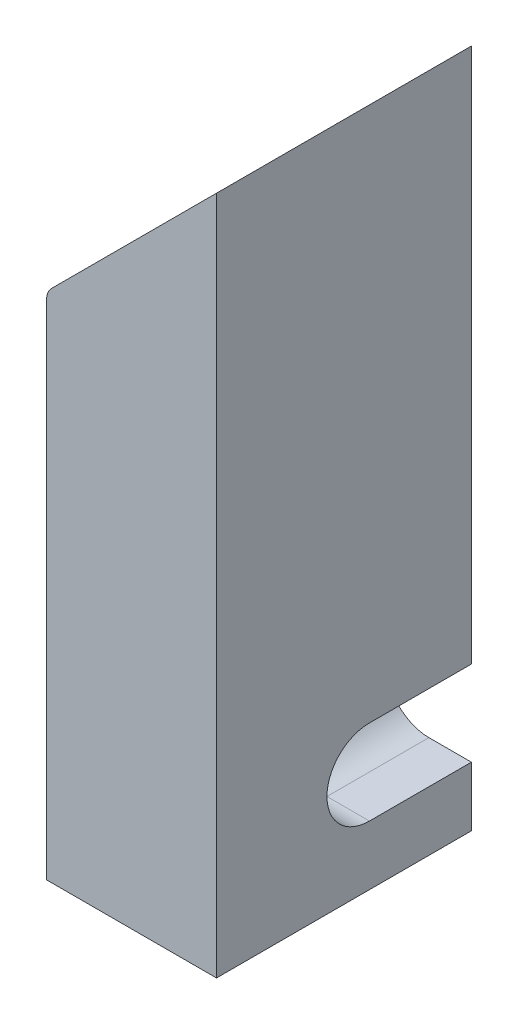
ISO-10303-21;
HEADER;
FILE_DESCRIPTION(('STEP AP214'),'2;1');
FILE_NAME('part.step','',(''),(''),'','','');
FILE_SCHEMA(('AUTOMOTIVE_DESIGN { 1 0 10303 214 1 1 1 1 }'));
ENDSEC;
DATA;
#1=APPLICATION_CONTEXT('core data for automotive mechanical design processes');
#2=APPLICATION_PROTOCOL_DEFINITION('international standard','automotive_design',2000,#1);
#3=PRODUCT_CONTEXT('',#1,'mechanical');
#4=PRODUCT('Part','Part','',(#3));
#5=PRODUCT_RELATED_PRODUCT_CATEGORY('part','',(#4));
#6=PRODUCT_DEFINITION_FORMATION('','',#4);
#7=PRODUCT_DEFINITION_CONTEXT('part definition',#1,'design');
#8=PRODUCT_DEFINITION('design','',#6,#7);
#9=PRODUCT_DEFINITION_SHAPE('','',#8);
#10=(LENGTH_UNIT() NAMED_UNIT(*) SI_UNIT(.MILLI.,.METRE.));
#11=(NAMED_UNIT(*) PLANE_ANGLE_UNIT() SI_UNIT($,.RADIAN.));
#12=(NAMED_UNIT(*) SI_UNIT($,.STERADIAN.) SOLID_ANGLE_UNIT());
#13=UNCERTAINTY_MEASURE_WITH_UNIT(LENGTH_MEASURE(1.E-05),#10,'distance_accuracy_value','');
#14=(GEOMETRIC_REPRESENTATION_CONTEXT(3) GLOBAL_UNCERTAINTY_ASSIGNED_CONTEXT((#13)) GLOBAL_UNIT_ASSIGNED_CONTEXT((#10,
#11,#12)) REPRESENTATION_CONTEXT('',''));
#15=CARTESIAN_POINT('',(0.,0.,0.));
#16=DIRECTION('',(0.,0.,1.));
#17=DIRECTION('',(1.,0.,0.));
#18=AXIS2_PLACEMENT_3D('',#15,#16,#17);
#19=CARTESIAN_POINT('',(10.,6.,6.));
#20=DIRECTION('',(-1.,0.,0.));
#21=DIRECTION('',(0.,0.,1.));
#22=AXIS2_PLACEMENT_3D('',#19,#20,#21);
#23=CYLINDRICAL_SURFACE('',#22,2.5);
#24=CARTESIAN_POINT('',(0.,6.,6.));
#25=DIRECTION('',(-1.,0.,0.));
#26=DIRECTION('',(0.,0.,1.));
#27=AXIS2_PLACEMENT_3D('',#24,#25,#26);
#28=CIRCLE('',#27,2.5);
#29=CARTESIAN_POINT('',(0.,6.,8.5));
#30=VERTEX_POINT('',#29);
#31=EDGE_CURVE('E144',#30,#30,#28,.T.);
#32=ORIENTED_EDGE('',*,*,#31,.T.);
#33=EDGE_LOOP('',(#32));
#34=FACE_BOUND('',#33,.T.);
#35=DIRECTION('',(-1.,0.,0.));
#36=VECTOR('',#35,1.);
#37=CARTESIAN_POINT('',(0.,3.5,5.99999999999999));
#38=LINE('',#37,#36);
#39=CARTESIAN_POINT('',(10.,3.5,5.99999999999999));
#40=VERTEX_POINT('',#39);
#41=CARTESIAN_POINT('',(7.5,3.5,5.99999999999999));
#42=VERTEX_POINT('',#41);
#43=EDGE_CURVE('E119',#40,#42,#38,.T.);
#44=ORIENTED_EDGE('',*,*,#43,.T.);
#45=CARTESIAN_POINT('',(7.5,6.,6.));
#46=DIRECTION('',(-0.707106781186547,0.,0.707106781186547));
#47=DIRECTION('',(-0.707106781186547,0.,-0.707106781186547));
#48=AXIS2_PLACEMENT_3D('',#45,#46,#47);
#49=ELLIPSE('',#48,3.53553390593274,2.5);
#50=CARTESIAN_POINT('',(7.5,8.5,5.99999999999999));
#51=VERTEX_POINT('',#50);
#52=EDGE_CURVE('E176',#42,#51,#49,.F.);
#53=ORIENTED_EDGE('',*,*,#52,.T.);
#54=DIRECTION('',(1.,0.,0.));
#55=VECTOR('',#54,1.);
#56=CARTESIAN_POINT('',(0.,8.50000000000001,5.99999999999999));
#57=LINE('',#56,#55);
#58=CARTESIAN_POINT('',(10.,8.5,6.));
#59=VERTEX_POINT('',#58);
#60=EDGE_CURVE('E129',#51,#59,#57,.T.);
#61=ORIENTED_EDGE('',*,*,#60,.T.);
#62=CARTESIAN_POINT('',(10.,6.,6.));
#63=DIRECTION('',(-1.,0.,0.));
#64=DIRECTION('',(0.,0.,1.));
#65=AXIS2_PLACEMENT_3D('',#62,#63,#64);
#66=CIRCLE('',#65,2.5);
#67=EDGE_CURVE('E137',#40,#59,#66,.T.);
#68=ORIENTED_EDGE('',*,*,#67,.F.);
#69=EDGE_LOOP('',(#44,#53,#61,#68));
#70=FACE_BOUND('',#69,.T.);
#71=ADVANCED_FACE('F48',(#34,#70),#23,.F.);
#72=CARTESIAN_POINT('',(0.,0.,15.));
#73=DIRECTION('',(0.,1.,0.));
#74=DIRECTION('',(0.,0.,1.));
#75=AXIS2_PLACEMENT_3D('',#72,#73,#74);
#76=PLANE('',#75);
#77=DIRECTION('',(1.,0.,0.));
#78=VECTOR('',#77,1.);
#79=CARTESIAN_POINT('',(0.,0.,0.));
#80=LINE('',#79,#78);
#81=CARTESIAN_POINT('',(0.,0.,0.));
#82=VERTEX_POINT('',#81);
#83=CARTESIAN_POINT('',(10.,0.,0.));
#84=VERTEX_POINT('',#83);
#85=EDGE_CURVE('E143',#82,#84,#80,.T.);
#86=ORIENTED_EDGE('',*,*,#85,.T.);
#87=DIRECTION('',(0.,0.,-1.));
#88=VECTOR('',#87,1.);
#89=CARTESIAN_POINT('',(10.,0.,15.));
#90=LINE('',#89,#88);
#91=CARTESIAN_POINT('',(10.,0.,15.));
#92=VERTEX_POINT('',#91);
#93=EDGE_CURVE('E174',#92,#84,#90,.T.);
#94=ORIENTED_EDGE('',*,*,#93,.F.);
#95=DIRECTION('',(1.,0.,0.));
#96=VECTOR('',#95,1.);
#97=CARTESIAN_POINT('',(0.,0.,15.));
#98=LINE('',#97,#96);
#99=CARTESIAN_POINT('',(0.,0.,15.));
#100=VERTEX_POINT('',#99);
#101=EDGE_CURVE('E154',#100,#92,#98,.T.);
#102=ORIENTED_EDGE('',*,*,#101,.F.);
#103=DIRECTION('',(0.,0.,-1.));
#104=VECTOR('',#103,1.);
#105=CARTESIAN_POINT('',(0.,0.,15.));
#106=LINE('',#105,#104);
#107=EDGE_CURVE('E163',#100,#82,#106,.T.);
#108=ORIENTED_EDGE('',*,*,#107,.T.);
#109=EDGE_LOOP('',(#86,#94,#102,#108));
#110=FACE_BOUND('',#109,.T.);
#111=ADVANCED_FACE('F192',(#110),#76,.F.);
#112=CARTESIAN_POINT('',(10.,0.,15.));
#113=DIRECTION('',(-1.,0.,0.));
#114=DIRECTION('',(0.,0.,1.));
#115=AXIS2_PLACEMENT_3D('',#112,#113,#114);
#116=PLANE('',#115);
#117=DIRECTION('',(0.,1.,0.));
#118=VECTOR('',#117,1.);
#119=CARTESIAN_POINT('',(10.,0.,0.));
#120=LINE('',#119,#118);
#121=CARTESIAN_POINT('',(10.,3.5,0.));
#122=VERTEX_POINT('',#121);
#123=EDGE_CURVE('E139',#84,#122,#120,.T.);
#124=ORIENTED_EDGE('',*,*,#123,.T.);
#125=DIRECTION('',(0.,0.,-1.));
#126=VECTOR('',#125,1.);
#127=CARTESIAN_POINT('',(10.,3.5,5.99999999999999));
#128=LINE('',#127,#126);
#129=EDGE_CURVE('E123',#40,#122,#128,.T.);
#130=ORIENTED_EDGE('',*,*,#129,.F.);
#131=ORIENTED_EDGE('',*,*,#67,.T.);
#132=DIRECTION('',(0.,0.,-1.));
#133=VECTOR('',#132,1.);
#134=CARTESIAN_POINT('',(10.,8.5,5.99999999999999));
#135=LINE('',#134,#133);
#136=CARTESIAN_POINT('',(10.,8.5,0.));
#137=VERTEX_POINT('',#136);
#138=EDGE_CURVE('E150',#59,#137,#135,.T.);
#139=ORIENTED_EDGE('',*,*,#138,.T.);
#140=CARTESIAN_POINT('',(10.,40.,0.));
#141=VERTEX_POINT('',#140);
#142=EDGE_CURVE('E147',#137,#141,#120,.T.);
#143=ORIENTED_EDGE('',*,*,#142,.T.);
#144=DIRECTION('',(0.,0.,-1.));
#145=VECTOR('',#144,1.);
#146=CARTESIAN_POINT('',(10.,40.,15.));
#147=LINE('',#146,#145);
#148=CARTESIAN_POINT('',(10.,40.,15.));
#149=VERTEX_POINT('',#148);
#150=EDGE_CURVE('E171',#149,#141,#147,.T.);
#151=ORIENTED_EDGE('',*,*,#150,.F.);
#152=DIRECTION('',(0.,1.,0.));
#153=VECTOR('',#152,1.);
#154=CARTESIAN_POINT('',(10.,0.,15.));
#155=LINE('',#154,#153);
#156=EDGE_CURVE('E157',#92,#149,#155,.T.);
#157=ORIENTED_EDGE('',*,*,#156,.F.);
#158=ORIENTED_EDGE('',*,*,#93,.T.);
#159=EDGE_LOOP('',(#124,#130,#131,#139,#143,#151,#157,#158));
#160=FACE_BOUND('',#159,.T.);
#161=ADVANCED_FACE('F135',(#160),#116,.F.);
#162=CARTESIAN_POINT('',(0.,30.,15.));
#163=DIRECTION('',(0.707106781186548,-0.707106781186547,0.));
#164=DIRECTION('',(0.707106781186547,0.707106781186548,0.));
#165=AXIS2_PLACEMENT_3D('',#162,#163,#164);
#166=PLANE('',#165);
#167=DIRECTION('',(-0.707106781186547,-0.707106781186548,0.));
#168=VECTOR('',#167,1.);
#169=CARTESIAN_POINT('',(0.,30.,0.));
#170=LINE('',#169,#168);
#171=CARTESIAN_POINT('',(0.292893218813452,30.2928932188135,0.));
#172=VERTEX_POINT('',#171);
#173=EDGE_CURVE('E166',#141,#172,#170,.T.);
#174=ORIENTED_EDGE('',*,*,#173,.T.);
#175=DIRECTION('',(0.,0.,-1.));
#176=VECTOR('',#175,1.);
#177=CARTESIAN_POINT('',(0.292893218813452,30.2928932188135,15.));
#178=LINE('',#177,#176);
#179=CARTESIAN_POINT('',(0.292893218813452,30.2928932188135,15.));
#180=VERTEX_POINT('',#179);
#181=EDGE_CURVE('E56',#172,#180,#178,.F.);
#182=ORIENTED_EDGE('',*,*,#181,.T.);
#183=DIRECTION('',(-0.707106781186547,-0.707106781186548,0.));
#184=VECTOR('',#183,1.);
#185=CARTESIAN_POINT('',(0.,30.,15.));
#186=LINE('',#185,#184);
#187=EDGE_CURVE('E160',#149,#180,#186,.T.);
#188=ORIENTED_EDGE('',*,*,#187,.F.);
#189=ORIENTED_EDGE('',*,*,#150,.T.);
#190=EDGE_LOOP('',(#174,#182,#188,#189));
#191=FACE_BOUND('',#190,.T.);
#192=ADVANCED_FACE('F220',(#191),#166,.F.);
#193=CARTESIAN_POINT('',(0.,0.,15.));
#194=DIRECTION('',(1.,0.,0.));
#195=DIRECTION('',(0.,0.,-1.));
#196=AXIS2_PLACEMENT_3D('',#193,#194,#195);
#197=PLANE('',#196);
#198=ORIENTED_EDGE('',*,*,#31,.F.);
#199=EDGE_LOOP('',(#198));
#200=FACE_BOUND('',#199,.T.);
#201=DIRECTION('',(0.,-1.,0.));
#202=VECTOR('',#201,1.);
#203=CARTESIAN_POINT('',(0.,0.,15.));
#204=LINE('',#203,#202);
#205=CARTESIAN_POINT('',(0.,29.5857864376269,15.));
#206=VERTEX_POINT('',#205);
#207=EDGE_CURVE('E162',#206,#100,#204,.T.);
#208=ORIENTED_EDGE('',*,*,#207,.F.);
#209=DIRECTION('',(0.,0.,-1.));
#210=VECTOR('',#209,1.);
#211=CARTESIAN_POINT('',(0.,29.5857864376269,15.));
#212=LINE('',#211,#210);
#213=CARTESIAN_POINT('',(0.,29.5857864376269,0.));
#214=VERTEX_POINT('',#213);
#215=EDGE_CURVE('E178',#206,#214,#212,.T.);
#216=ORIENTED_EDGE('',*,*,#215,.T.);
#217=DIRECTION('',(0.,-1.,0.));
#218=VECTOR('',#217,1.);
#219=CARTESIAN_POINT('',(0.,0.,0.));
#220=LINE('',#219,#218);
#221=EDGE_CURVE('E158',#214,#82,#220,.T.);
#222=ORIENTED_EDGE('',*,*,#221,.T.);
#223=ORIENTED_EDGE('',*,*,#107,.F.);
#224=EDGE_LOOP('',(#208,#216,#222,#223));
#225=FACE_BOUND('',#224,.T.);
#226=ADVANCED_FACE('F184',(#200,#225),#197,.F.);
#227=CARTESIAN_POINT('',(0.,0.,15.));
#228=DIRECTION('',(0.,0.,1.));
#229=DIRECTION('',(1.,0.,0.));
#230=AXIS2_PLACEMENT_3D('',#227,#228,#229);
#231=PLANE('',#230);
#232=ORIENTED_EDGE('',*,*,#187,.T.);
#233=CARTESIAN_POINT('',(1.,29.5857864376269,15.));
#234=DIRECTION('',(0.,0.,1.));
#235=DIRECTION('',(1.,0.,0.));
#236=AXIS2_PLACEMENT_3D('',#233,#234,#235);
#237=CIRCLE('',#236,1.);
#238=EDGE_CURVE('E12',#180,#206,#237,.T.);
#239=ORIENTED_EDGE('',*,*,#238,.T.);
#240=ORIENTED_EDGE('',*,*,#207,.T.);
#241=ORIENTED_EDGE('',*,*,#101,.T.);
#242=ORIENTED_EDGE('',*,*,#156,.T.);
#243=EDGE_LOOP('',(#232,#239,#240,#241,#242));
#244=FACE_BOUND('',#243,.T.);
#245=ADVANCED_FACE('F195',(#244),#231,.T.);
#246=CARTESIAN_POINT('',(0.,0.,0.));
#247=DIRECTION('',(0.,0.,1.));
#248=DIRECTION('',(1.,0.,0.));
#249=AXIS2_PLACEMENT_3D('',#246,#247,#248);
#250=PLANE('',#249);
#251=ORIENTED_EDGE('',*,*,#221,.F.);
#252=CARTESIAN_POINT('',(1.,29.5857864376269,0.));
#253=DIRECTION('',(0.,0.,1.));
#254=DIRECTION('',(1.,0.,0.));
#255=AXIS2_PLACEMENT_3D('',#252,#253,#254);
#256=CIRCLE('',#255,1.);
#257=EDGE_CURVE('E70',#214,#172,#256,.F.);
#258=ORIENTED_EDGE('',*,*,#257,.T.);
#259=ORIENTED_EDGE('',*,*,#173,.F.);
#260=ORIENTED_EDGE('',*,*,#142,.F.);
#261=DIRECTION('',(1.,0.,0.));
#262=VECTOR('',#261,1.);
#263=CARTESIAN_POINT('',(0.,8.50000000000001,0.));
#264=LINE('',#263,#262);
#265=CARTESIAN_POINT('',(7.5,8.5,0.));
#266=VERTEX_POINT('',#265);
#267=EDGE_CURVE('E130',#266,#137,#264,.T.);
#268=ORIENTED_EDGE('',*,*,#267,.F.);
#269=CARTESIAN_POINT('',(7.5,6.,0.));
#270=DIRECTION('',(0.,0.,-1.));
#271=DIRECTION('',(-1.,0.,0.));
#272=AXIS2_PLACEMENT_3D('',#269,#270,#271);
#273=CIRCLE('',#272,2.5);
#274=CARTESIAN_POINT('',(7.5,3.5,0.));
#275=VERTEX_POINT('',#274);
#276=EDGE_CURVE('E295',#275,#266,#273,.T.);
#277=ORIENTED_EDGE('',*,*,#276,.F.);
#278=DIRECTION('',(-1.,0.,0.));
#279=VECTOR('',#278,1.);
#280=CARTESIAN_POINT('',(0.,3.5,0.));
#281=LINE('',#280,#279);
#282=EDGE_CURVE('E298',#122,#275,#281,.T.);
#283=ORIENTED_EDGE('',*,*,#282,.F.);
#284=ORIENTED_EDGE('',*,*,#123,.F.);
#285=ORIENTED_EDGE('',*,*,#85,.F.);
#286=EDGE_LOOP('',(#251,#258,#259,#260,#268,#277,#283,#284,#285));
#287=FACE_BOUND('',#286,.T.);
#288=ADVANCED_FACE('F189',(#287),#250,.F.);
#289=CARTESIAN_POINT('',(7.5,6.,5.99999999999999));
#290=DIRECTION('',(0.,0.,-1.));
#291=DIRECTION('',(-1.,0.,0.));
#292=AXIS2_PLACEMENT_3D('',#289,#290,#291);
#293=CYLINDRICAL_SURFACE('',#292,2.5);
#294=DIRECTION('',(0.,0.,-1.));
#295=VECTOR('',#294,1.);
#296=CARTESIAN_POINT('',(7.5,3.5,5.99999999999999));
#297=LINE('',#296,#295);
#298=EDGE_CURVE('E125',#42,#275,#297,.T.);
#299=ORIENTED_EDGE('',*,*,#298,.T.);
#300=ORIENTED_EDGE('',*,*,#276,.T.);
#301=DIRECTION('',(0.,0.,-1.));
#302=VECTOR('',#301,1.);
#303=CARTESIAN_POINT('',(7.5,8.5,5.99999999999999));
#304=LINE('',#303,#302);
#305=EDGE_CURVE('E297',#51,#266,#304,.T.);
#306=ORIENTED_EDGE('',*,*,#305,.F.);
#307=ORIENTED_EDGE('',*,*,#52,.F.);
#308=EDGE_LOOP('',(#299,#300,#306,#307));
#309=FACE_BOUND('',#308,.T.);
#310=ADVANCED_FACE('F217',(#309),#293,.F.);
#311=CARTESIAN_POINT('',(0.,3.5,5.99999999999999));
#312=DIRECTION('',(0.,-1.,0.));
#313=DIRECTION('',(1.,0.,0.));
#314=AXIS2_PLACEMENT_3D('',#311,#312,#313);
#315=PLANE('',#314);
#316=ORIENTED_EDGE('',*,*,#282,.T.);
#317=ORIENTED_EDGE('',*,*,#298,.F.);
#318=ORIENTED_EDGE('',*,*,#43,.F.);
#319=ORIENTED_EDGE('',*,*,#129,.T.);
#320=EDGE_LOOP('',(#316,#317,#318,#319));
#321=FACE_BOUND('',#320,.T.);
#322=ADVANCED_FACE('F122',(#321),#315,.F.);
#323=CARTESIAN_POINT('',(0.,8.50000000000001,5.99999999999999));
#324=DIRECTION('',(0.,1.,0.));
#325=DIRECTION('',(-1.,0.,0.));
#326=AXIS2_PLACEMENT_3D('',#323,#324,#325);
#327=PLANE('',#326);
#328=ORIENTED_EDGE('',*,*,#267,.T.);
#329=ORIENTED_EDGE('',*,*,#138,.F.);
#330=ORIENTED_EDGE('',*,*,#60,.F.);
#331=ORIENTED_EDGE('',*,*,#305,.T.);
#332=EDGE_LOOP('',(#328,#329,#330,#331));
#333=FACE_BOUND('',#332,.T.);
#334=ADVANCED_FACE('F198',(#333),#327,.F.);
#335=CARTESIAN_POINT('',(1.,29.5857864376269,15.));
#336=DIRECTION('',(0.,0.,-1.));
#337=DIRECTION('',(-1.,0.,0.));
#338=AXIS2_PLACEMENT_3D('',#335,#336,#337);
#339=CYLINDRICAL_SURFACE('',#338,1.);
#340=ORIENTED_EDGE('',*,*,#238,.F.);
#341=ORIENTED_EDGE('',*,*,#181,.F.);
#342=ORIENTED_EDGE('',*,*,#257,.F.);
#343=ORIENTED_EDGE('',*,*,#215,.F.);
#344=EDGE_LOOP('',(#340,#341,#342,#343));
#345=FACE_BOUND('',#344,.T.);
#346=ADVANCED_FACE('F50',(#345),#339,.T.);
#347=CLOSED_SHELL('',(#71,#111,#161,#192,#226,#245,#288,#310,#322,#334,#346));
#348=MANIFOLD_SOLID_BREP('B2',#347);
#349=ADVANCED_BREP_SHAPE_REPRESENTATION('',(#18,#348),#14);
#350=SHAPE_DEFINITION_REPRESENTATION(#9,#349);
ENDSEC;
END-ISO-10303-21;
